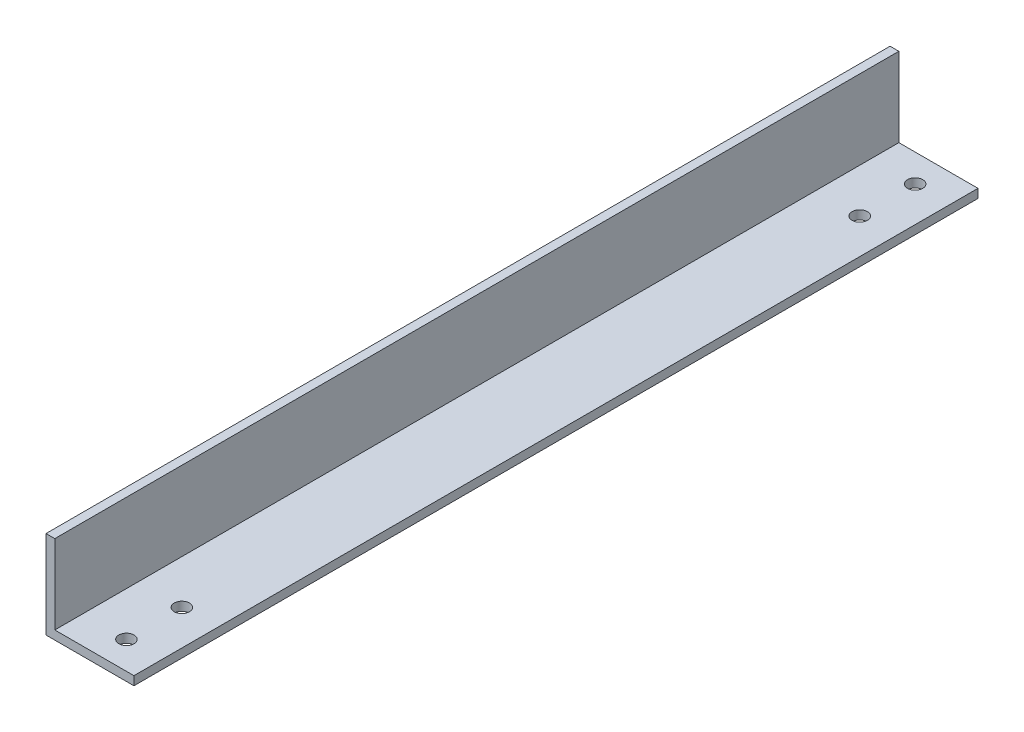
ISO-10303-21;
HEADER;
FILE_DESCRIPTION(('STEP AP214'),'2;1');
FILE_NAME('part.step','',(''),(''),'','','');
FILE_SCHEMA(('AUTOMOTIVE_DESIGN { 1 0 10303 214 1 1 1 1 }'));
ENDSEC;
DATA;
#1=APPLICATION_CONTEXT('core data for automotive mechanical design processes');
#2=APPLICATION_PROTOCOL_DEFINITION('international standard','automotive_design',2000,#1);
#3=PRODUCT_CONTEXT('',#1,'mechanical');
#4=PRODUCT('Part','Part','',(#3));
#5=PRODUCT_RELATED_PRODUCT_CATEGORY('part','',(#4));
#6=PRODUCT_DEFINITION_FORMATION('','',#4);
#7=PRODUCT_DEFINITION_CONTEXT('part definition',#1,'design');
#8=PRODUCT_DEFINITION('design','',#6,#7);
#9=PRODUCT_DEFINITION_SHAPE('','',#8);
#10=(LENGTH_UNIT() NAMED_UNIT(*) SI_UNIT(.MILLI.,.METRE.));
#11=(NAMED_UNIT(*) PLANE_ANGLE_UNIT() SI_UNIT($,.RADIAN.));
#12=(NAMED_UNIT(*) SI_UNIT($,.STERADIAN.) SOLID_ANGLE_UNIT());
#13=UNCERTAINTY_MEASURE_WITH_UNIT(LENGTH_MEASURE(1.E-05),#10,'distance_accuracy_value','');
#14=(GEOMETRIC_REPRESENTATION_CONTEXT(3) GLOBAL_UNCERTAINTY_ASSIGNED_CONTEXT((#13)) GLOBAL_UNIT_ASSIGNED_CONTEXT((#10,
#11,#12)) REPRESENTATION_CONTEXT('',''));
#15=CARTESIAN_POINT('',(0.,0.,0.));
#16=DIRECTION('',(0.,0.,1.));
#17=DIRECTION('',(1.,0.,0.));
#18=AXIS2_PLACEMENT_3D('',#15,#16,#17);
#19=CARTESIAN_POINT('',(31.75,0.,304.8));
#20=DIRECTION('',(0.,1.,0.));
#21=DIRECTION('',(-1.,0.,0.));
#22=AXIS2_PLACEMENT_3D('',#19,#20,#21);
#23=PLANE('',#22);
#24=CARTESIAN_POINT('',(19.05,0.,10.));
#25=DIRECTION('',(0.,1.,0.));
#26=DIRECTION('',(-1.,0.,0.));
#27=AXIS2_PLACEMENT_3D('',#24,#25,#26);
#28=CIRCLE('',#27,2.74999999999999);
#29=CARTESIAN_POINT('',(16.3,0.,10.));
#30=VERTEX_POINT('',#29);
#31=EDGE_CURVE('E182',#30,#30,#28,.T.);
#32=ORIENTED_EDGE('',*,*,#31,.T.);
#33=EDGE_LOOP('',(#32));
#34=FACE_BOUND('',#33,.T.);
#35=CARTESIAN_POINT('',(19.05,0.,294.8));
#36=DIRECTION('',(0.,1.,0.));
#37=DIRECTION('',(-1.,0.,0.));
#38=AXIS2_PLACEMENT_3D('',#35,#36,#37);
#39=CIRCLE('',#38,2.74999999999999);
#40=CARTESIAN_POINT('',(16.3,0.,294.8));
#41=VERTEX_POINT('',#40);
#42=EDGE_CURVE('E186',#41,#41,#39,.T.);
#43=ORIENTED_EDGE('',*,*,#42,.T.);
#44=EDGE_LOOP('',(#43));
#45=FACE_BOUND('',#44,.T.);
#46=CARTESIAN_POINT('',(19.05,0.,30.));
#47=DIRECTION('',(0.,1.,0.));
#48=DIRECTION('',(-1.,0.,0.));
#49=AXIS2_PLACEMENT_3D('',#46,#47,#48);
#50=CIRCLE('',#49,2.74999999999999);
#51=CARTESIAN_POINT('',(16.3,0.,30.));
#52=VERTEX_POINT('',#51);
#53=EDGE_CURVE('E190',#52,#52,#50,.T.);
#54=ORIENTED_EDGE('',*,*,#53,.T.);
#55=EDGE_LOOP('',(#54));
#56=FACE_BOUND('',#55,.T.);
#57=CARTESIAN_POINT('',(19.05,0.,274.8));
#58=DIRECTION('',(0.,1.,0.));
#59=DIRECTION('',(-1.,0.,0.));
#60=AXIS2_PLACEMENT_3D('',#57,#58,#59);
#61=CIRCLE('',#60,2.74999999999999);
#62=CARTESIAN_POINT('',(16.3,0.,274.8));
#63=VERTEX_POINT('',#62);
#64=EDGE_CURVE('E132',#63,#63,#61,.T.);
#65=ORIENTED_EDGE('',*,*,#64,.T.);
#66=EDGE_LOOP('',(#65));
#67=FACE_BOUND('',#66,.T.);
#68=DIRECTION('',(1.,0.,0.));
#69=VECTOR('',#68,1.);
#70=CARTESIAN_POINT('',(31.75,0.,0.));
#71=LINE('',#70,#69);
#72=CARTESIAN_POINT('',(0.,0.,0.));
#73=VERTEX_POINT('',#72);
#74=CARTESIAN_POINT('',(31.75,0.,0.));
#75=VERTEX_POINT('',#74);
#76=EDGE_CURVE('E127',#73,#75,#71,.T.);
#77=ORIENTED_EDGE('',*,*,#76,.T.);
#78=DIRECTION('',(0.,0.,-1.));
#79=VECTOR('',#78,1.);
#80=CARTESIAN_POINT('',(31.75,0.,304.8));
#81=LINE('',#80,#79);
#82=CARTESIAN_POINT('',(31.75,0.,304.8));
#83=VERTEX_POINT('',#82);
#84=EDGE_CURVE('E11',#83,#75,#81,.T.);
#85=ORIENTED_EDGE('',*,*,#84,.F.);
#86=DIRECTION('',(1.,0.,0.));
#87=VECTOR('',#86,1.);
#88=CARTESIAN_POINT('',(31.75,0.,304.8));
#89=LINE('',#88,#87);
#90=CARTESIAN_POINT('',(0.,0.,304.8));
#91=VERTEX_POINT('',#90);
#92=EDGE_CURVE('E144',#91,#83,#89,.T.);
#93=ORIENTED_EDGE('',*,*,#92,.F.);
#94=DIRECTION('',(0.,0.,-1.));
#95=VECTOR('',#94,1.);
#96=CARTESIAN_POINT('',(0.,0.,304.8));
#97=LINE('',#96,#95);
#98=EDGE_CURVE('E123',#91,#73,#97,.T.);
#99=ORIENTED_EDGE('',*,*,#98,.T.);
#100=EDGE_LOOP('',(#77,#85,#93,#99));
#101=FACE_BOUND('',#100,.T.);
#102=ADVANCED_FACE('F38',(#34,#45,#56,#67,#101),#23,.F.);
#103=CARTESIAN_POINT('',(31.75,3.175,304.8));
#104=DIRECTION('',(-1.,0.,0.));
#105=DIRECTION('',(0.,0.,1.));
#106=AXIS2_PLACEMENT_3D('',#103,#104,#105);
#107=PLANE('',#106);
#108=DIRECTION('',(0.,1.,0.));
#109=VECTOR('',#108,1.);
#110=CARTESIAN_POINT('',(31.75,3.175,0.));
#111=LINE('',#110,#109);
#112=CARTESIAN_POINT('',(31.75,3.175,0.));
#113=VERTEX_POINT('',#112);
#114=EDGE_CURVE('E131',#75,#113,#111,.T.);
#115=ORIENTED_EDGE('',*,*,#114,.T.);
#116=DIRECTION('',(0.,0.,-1.));
#117=VECTOR('',#116,1.);
#118=CARTESIAN_POINT('',(31.75,3.175,304.8));
#119=LINE('',#118,#117);
#120=CARTESIAN_POINT('',(31.75,3.175,304.8));
#121=VERTEX_POINT('',#120);
#122=EDGE_CURVE('E47',#121,#113,#119,.T.);
#123=ORIENTED_EDGE('',*,*,#122,.F.);
#124=DIRECTION('',(0.,1.,0.));
#125=VECTOR('',#124,1.);
#126=CARTESIAN_POINT('',(31.75,3.175,304.8));
#127=LINE('',#126,#125);
#128=EDGE_CURVE('E92',#83,#121,#127,.T.);
#129=ORIENTED_EDGE('',*,*,#128,.F.);
#130=ORIENTED_EDGE('',*,*,#84,.T.);
#131=EDGE_LOOP('',(#115,#123,#129,#130));
#132=FACE_BOUND('',#131,.T.);
#133=ADVANCED_FACE('F172',(#132),#107,.F.);
#134=CARTESIAN_POINT('',(3.175,3.175,304.8));
#135=DIRECTION('',(0.,-1.,0.));
#136=DIRECTION('',(0.,0.,-1.));
#137=AXIS2_PLACEMENT_3D('',#134,#135,#136);
#138=PLANE('',#137);
#139=CARTESIAN_POINT('',(19.05,3.175,10.));
#140=DIRECTION('',(0.,1.,0.));
#141=DIRECTION('',(0.,0.,1.));
#142=AXIS2_PLACEMENT_3D('',#139,#140,#141);
#143=CIRCLE('',#142,2.75);
#144=CARTESIAN_POINT('',(19.05,3.175,12.75));
#145=VERTEX_POINT('',#144);
#146=EDGE_CURVE('E220',#145,#145,#143,.T.);
#147=ORIENTED_EDGE('',*,*,#146,.F.);
#148=EDGE_LOOP('',(#147));
#149=FACE_BOUND('',#148,.T.);
#150=CARTESIAN_POINT('',(19.05,3.175,294.8));
#151=DIRECTION('',(0.,1.,0.));
#152=DIRECTION('',(0.,0.,1.));
#153=AXIS2_PLACEMENT_3D('',#150,#151,#152);
#154=CIRCLE('',#153,2.75);
#155=CARTESIAN_POINT('',(19.05,3.175,297.55));
#156=VERTEX_POINT('',#155);
#157=EDGE_CURVE('E214',#156,#156,#154,.T.);
#158=ORIENTED_EDGE('',*,*,#157,.F.);
#159=EDGE_LOOP('',(#158));
#160=FACE_BOUND('',#159,.T.);
#161=CARTESIAN_POINT('',(19.05,3.175,30.));
#162=DIRECTION('',(0.,1.,0.));
#163=DIRECTION('',(0.,0.,1.));
#164=AXIS2_PLACEMENT_3D('',#161,#162,#163);
#165=CIRCLE('',#164,2.75);
#166=CARTESIAN_POINT('',(19.05,3.175,32.75));
#167=VERTEX_POINT('',#166);
#168=EDGE_CURVE('E208',#167,#167,#165,.T.);
#169=ORIENTED_EDGE('',*,*,#168,.F.);
#170=EDGE_LOOP('',(#169));
#171=FACE_BOUND('',#170,.T.);
#172=CARTESIAN_POINT('',(19.05,3.175,274.8));
#173=DIRECTION('',(0.,1.,0.));
#174=DIRECTION('',(0.,0.,1.));
#175=AXIS2_PLACEMENT_3D('',#172,#173,#174);
#176=CIRCLE('',#175,2.75);
#177=CARTESIAN_POINT('',(19.05,3.175,277.55));
#178=VERTEX_POINT('',#177);
#179=EDGE_CURVE('E195',#178,#178,#176,.T.);
#180=ORIENTED_EDGE('',*,*,#179,.F.);
#181=EDGE_LOOP('',(#180));
#182=FACE_BOUND('',#181,.T.);
#183=DIRECTION('',(-1.,0.,0.));
#184=VECTOR('',#183,1.);
#185=CARTESIAN_POINT('',(3.175,3.175,0.));
#186=LINE('',#185,#184);
#187=CARTESIAN_POINT('',(3.175,3.175,0.));
#188=VERTEX_POINT('',#187);
#189=EDGE_CURVE('E135',#113,#188,#186,.T.);
#190=ORIENTED_EDGE('',*,*,#189,.T.);
#191=DIRECTION('',(0.,0.,-1.));
#192=VECTOR('',#191,1.);
#193=CARTESIAN_POINT('',(3.175,3.175,304.8));
#194=LINE('',#193,#192);
#195=CARTESIAN_POINT('',(3.175,3.175,304.8));
#196=VERTEX_POINT('',#195);
#197=EDGE_CURVE('E116',#196,#188,#194,.T.);
#198=ORIENTED_EDGE('',*,*,#197,.F.);
#199=DIRECTION('',(-1.,0.,0.));
#200=VECTOR('',#199,1.);
#201=CARTESIAN_POINT('',(3.175,3.175,304.8));
#202=LINE('',#201,#200);
#203=EDGE_CURVE('E105',#121,#196,#202,.T.);
#204=ORIENTED_EDGE('',*,*,#203,.F.);
#205=ORIENTED_EDGE('',*,*,#122,.T.);
#206=EDGE_LOOP('',(#190,#198,#204,#205));
#207=FACE_BOUND('',#206,.T.);
#208=ADVANCED_FACE('F154',(#149,#160,#171,#182,#207),#138,.F.);
#209=CARTESIAN_POINT('',(3.175,31.75,304.8));
#210=DIRECTION('',(-1.,0.,0.));
#211=DIRECTION('',(0.,-1.,0.));
#212=AXIS2_PLACEMENT_3D('',#209,#210,#211);
#213=PLANE('',#212);
#214=DIRECTION('',(0.,1.,0.));
#215=VECTOR('',#214,1.);
#216=CARTESIAN_POINT('',(3.175,31.75,0.));
#217=LINE('',#216,#215);
#218=CARTESIAN_POINT('',(3.175,31.75,0.));
#219=VERTEX_POINT('',#218);
#220=EDGE_CURVE('E114',#188,#219,#217,.T.);
#221=ORIENTED_EDGE('',*,*,#220,.T.);
#222=DIRECTION('',(0.,0.,-1.));
#223=VECTOR('',#222,1.);
#224=CARTESIAN_POINT('',(3.175,31.75,304.8));
#225=LINE('',#224,#223);
#226=CARTESIAN_POINT('',(3.175,31.75,304.8));
#227=VERTEX_POINT('',#226);
#228=EDGE_CURVE('E111',#227,#219,#225,.T.);
#229=ORIENTED_EDGE('',*,*,#228,.F.);
#230=DIRECTION('',(0.,1.,0.));
#231=VECTOR('',#230,1.);
#232=CARTESIAN_POINT('',(3.175,31.75,304.8));
#233=LINE('',#232,#231);
#234=EDGE_CURVE('E99',#196,#227,#233,.T.);
#235=ORIENTED_EDGE('',*,*,#234,.F.);
#236=ORIENTED_EDGE('',*,*,#197,.T.);
#237=EDGE_LOOP('',(#221,#229,#235,#236));
#238=FACE_BOUND('',#237,.T.);
#239=ADVANCED_FACE('F112',(#238),#213,.F.);
#240=CARTESIAN_POINT('',(0.,31.75,304.8));
#241=DIRECTION('',(0.,-1.,0.));
#242=DIRECTION('',(0.,0.,-1.));
#243=AXIS2_PLACEMENT_3D('',#240,#241,#242);
#244=PLANE('',#243);
#245=DIRECTION('',(-1.,0.,0.));
#246=VECTOR('',#245,1.);
#247=CARTESIAN_POINT('',(0.,31.75,0.));
#248=LINE('',#247,#246);
#249=CARTESIAN_POINT('',(0.,31.75,0.));
#250=VERTEX_POINT('',#249);
#251=EDGE_CURVE('E78',#219,#250,#248,.T.);
#252=ORIENTED_EDGE('',*,*,#251,.T.);
#253=DIRECTION('',(0.,0.,-1.));
#254=VECTOR('',#253,1.);
#255=CARTESIAN_POINT('',(0.,31.75,304.8));
#256=LINE('',#255,#254);
#257=CARTESIAN_POINT('',(0.,31.75,304.8));
#258=VERTEX_POINT('',#257);
#259=EDGE_CURVE('E117',#258,#250,#256,.T.);
#260=ORIENTED_EDGE('',*,*,#259,.F.);
#261=DIRECTION('',(-1.,0.,0.));
#262=VECTOR('',#261,1.);
#263=CARTESIAN_POINT('',(0.,31.75,304.8));
#264=LINE('',#263,#262);
#265=EDGE_CURVE('E103',#227,#258,#264,.T.);
#266=ORIENTED_EDGE('',*,*,#265,.F.);
#267=ORIENTED_EDGE('',*,*,#228,.T.);
#268=EDGE_LOOP('',(#252,#260,#266,#267));
#269=FACE_BOUND('',#268,.T.);
#270=ADVANCED_FACE('F119',(#269),#244,.F.);
#271=CARTESIAN_POINT('',(0.,0.,304.8));
#272=DIRECTION('',(1.,0.,0.));
#273=DIRECTION('',(0.,0.,-1.));
#274=AXIS2_PLACEMENT_3D('',#271,#272,#273);
#275=PLANE('',#274);
#276=DIRECTION('',(0.,-1.,0.));
#277=VECTOR('',#276,1.);
#278=CARTESIAN_POINT('',(0.,0.,0.));
#279=LINE('',#278,#277);
#280=EDGE_CURVE('E84',#250,#73,#279,.T.);
#281=ORIENTED_EDGE('',*,*,#280,.T.);
#282=ORIENTED_EDGE('',*,*,#98,.F.);
#283=DIRECTION('',(0.,-1.,0.));
#284=VECTOR('',#283,1.);
#285=CARTESIAN_POINT('',(0.,0.,304.8));
#286=LINE('',#285,#284);
#287=EDGE_CURVE('E55',#258,#91,#286,.T.);
#288=ORIENTED_EDGE('',*,*,#287,.F.);
#289=ORIENTED_EDGE('',*,*,#259,.T.);
#290=EDGE_LOOP('',(#281,#282,#288,#289));
#291=FACE_BOUND('',#290,.T.);
#292=ADVANCED_FACE('F161',(#291),#275,.F.);
#293=CARTESIAN_POINT('',(0.,0.,304.8));
#294=DIRECTION('',(0.,0.,-1.));
#295=DIRECTION('',(-1.,0.,0.));
#296=AXIS2_PLACEMENT_3D('',#293,#294,#295);
#297=PLANE('',#296);
#298=ORIENTED_EDGE('',*,*,#92,.T.);
#299=ORIENTED_EDGE('',*,*,#128,.T.);
#300=ORIENTED_EDGE('',*,*,#203,.T.);
#301=ORIENTED_EDGE('',*,*,#234,.T.);
#302=ORIENTED_EDGE('',*,*,#265,.T.);
#303=ORIENTED_EDGE('',*,*,#287,.T.);
#304=EDGE_LOOP('',(#298,#299,#300,#301,#302,#303));
#305=FACE_BOUND('',#304,.T.);
#306=ADVANCED_FACE('F101',(#305),#297,.F.);
#307=CARTESIAN_POINT('',(0.,0.,0.));
#308=DIRECTION('',(0.,0.,-1.));
#309=DIRECTION('',(-1.,0.,0.));
#310=AXIS2_PLACEMENT_3D('',#307,#308,#309);
#311=PLANE('',#310);
#312=ORIENTED_EDGE('',*,*,#76,.F.);
#313=ORIENTED_EDGE('',*,*,#280,.F.);
#314=ORIENTED_EDGE('',*,*,#251,.F.);
#315=ORIENTED_EDGE('',*,*,#220,.F.);
#316=ORIENTED_EDGE('',*,*,#189,.F.);
#317=ORIENTED_EDGE('',*,*,#114,.F.);
#318=EDGE_LOOP('',(#312,#313,#314,#315,#316,#317));
#319=FACE_BOUND('',#318,.T.);
#320=ADVANCED_FACE('F157',(#319),#311,.T.);
#321=CARTESIAN_POINT('',(19.05,3.175,274.8));
#322=DIRECTION('',(0.,1.,0.));
#323=DIRECTION('',(0.,0.,1.));
#324=AXIS2_PLACEMENT_3D('',#321,#322,#323);
#325=CYLINDRICAL_SURFACE('',#324,2.74999999999999);
#326=ORIENTED_EDGE('',*,*,#179,.T.);
#327=EDGE_LOOP('',(#326));
#328=FACE_BOUND('',#327,.T.);
#329=ORIENTED_EDGE('',*,*,#64,.F.);
#330=EDGE_LOOP('',(#329));
#331=FACE_BOUND('',#330,.T.);
#332=ADVANCED_FACE('F236',(#328,#331),#325,.F.);
#333=CARTESIAN_POINT('',(19.05,3.175,30.));
#334=DIRECTION('',(0.,1.,0.));
#335=DIRECTION('',(0.,0.,1.));
#336=AXIS2_PLACEMENT_3D('',#333,#334,#335);
#337=CYLINDRICAL_SURFACE('',#336,2.74999999999999);
#338=ORIENTED_EDGE('',*,*,#168,.T.);
#339=EDGE_LOOP('',(#338));
#340=FACE_BOUND('',#339,.T.);
#341=ORIENTED_EDGE('',*,*,#53,.F.);
#342=EDGE_LOOP('',(#341));
#343=FACE_BOUND('',#342,.T.);
#344=ADVANCED_FACE('F238',(#340,#343),#337,.F.);
#345=CARTESIAN_POINT('',(19.05,3.175,294.8));
#346=DIRECTION('',(0.,1.,0.));
#347=DIRECTION('',(0.,0.,1.));
#348=AXIS2_PLACEMENT_3D('',#345,#346,#347);
#349=CYLINDRICAL_SURFACE('',#348,2.74999999999999);
#350=ORIENTED_EDGE('',*,*,#157,.T.);
#351=EDGE_LOOP('',(#350));
#352=FACE_BOUND('',#351,.T.);
#353=ORIENTED_EDGE('',*,*,#42,.F.);
#354=EDGE_LOOP('',(#353));
#355=FACE_BOUND('',#354,.T.);
#356=ADVANCED_FACE('F244',(#352,#355),#349,.F.);
#357=CARTESIAN_POINT('',(19.05,3.175,10.));
#358=DIRECTION('',(0.,1.,0.));
#359=DIRECTION('',(0.,0.,1.));
#360=AXIS2_PLACEMENT_3D('',#357,#358,#359);
#361=CYLINDRICAL_SURFACE('',#360,2.74999999999999);
#362=ORIENTED_EDGE('',*,*,#146,.T.);
#363=EDGE_LOOP('',(#362));
#364=FACE_BOUND('',#363,.T.);
#365=ORIENTED_EDGE('',*,*,#31,.F.);
#366=EDGE_LOOP('',(#365));
#367=FACE_BOUND('',#366,.T.);
#368=ADVANCED_FACE('F225',(#364,#367),#361,.F.);
#369=CLOSED_SHELL('',(#102,#133,#208,#239,#270,#292,#306,#320,#332,#344,#356,#368));
#370=MANIFOLD_SOLID_BREP('B2',#369);
#371=ADVANCED_BREP_SHAPE_REPRESENTATION('',(#18,#370),#14);
#372=SHAPE_DEFINITION_REPRESENTATION(#9,#371);
ENDSEC;
END-ISO-10303-21;
